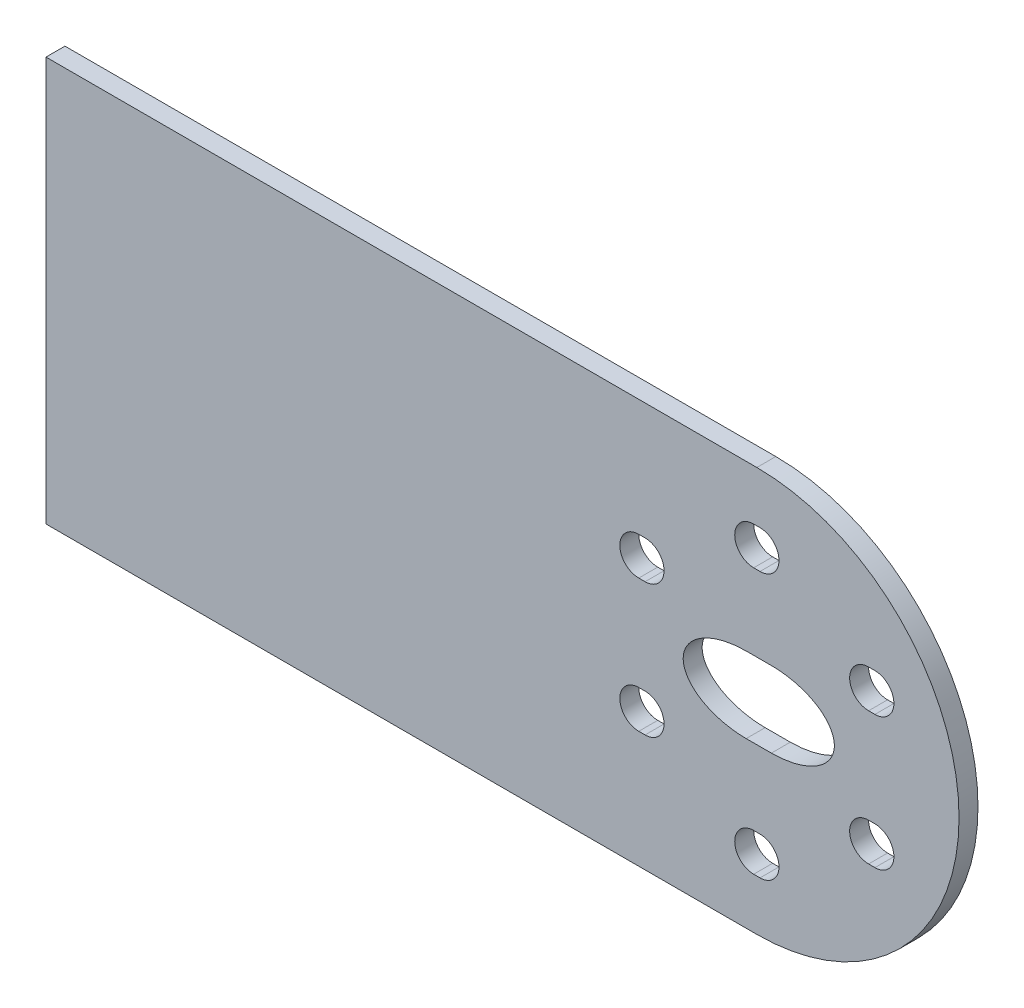
ISO-10303-21;
HEADER;
FILE_DESCRIPTION(('STEP AP214'),'2;1');
FILE_NAME('part.step','',(''),(''),'','','');
FILE_SCHEMA(('AUTOMOTIVE_DESIGN { 1 0 10303 214 1 1 1 1 }'));
ENDSEC;
DATA;
#1=APPLICATION_CONTEXT('core data for automotive mechanical design processes');
#2=APPLICATION_PROTOCOL_DEFINITION('international standard','automotive_design',2000,#1);
#3=PRODUCT_CONTEXT('',#1,'mechanical');
#4=PRODUCT('Part','Part','',(#3));
#5=PRODUCT_RELATED_PRODUCT_CATEGORY('part','',(#4));
#6=PRODUCT_DEFINITION_FORMATION('','',#4);
#7=PRODUCT_DEFINITION_CONTEXT('part definition',#1,'design');
#8=PRODUCT_DEFINITION('design','',#6,#7);
#9=PRODUCT_DEFINITION_SHAPE('','',#8);
#10=(LENGTH_UNIT() NAMED_UNIT(*) SI_UNIT(.MILLI.,.METRE.));
#11=(NAMED_UNIT(*) PLANE_ANGLE_UNIT() SI_UNIT($,.RADIAN.));
#12=(NAMED_UNIT(*) SI_UNIT($,.STERADIAN.) SOLID_ANGLE_UNIT());
#13=UNCERTAINTY_MEASURE_WITH_UNIT(LENGTH_MEASURE(1.E-05),#10,'distance_accuracy_value','');
#14=(GEOMETRIC_REPRESENTATION_CONTEXT(3) GLOBAL_UNCERTAINTY_ASSIGNED_CONTEXT((#13)) GLOBAL_UNIT_ASSIGNED_CONTEXT((#10,
#11,#12)) REPRESENTATION_CONTEXT('',''));
#15=CARTESIAN_POINT('',(0.,0.,0.));
#16=DIRECTION('',(0.,0.,1.));
#17=DIRECTION('',(1.,0.,0.));
#18=AXIS2_PLACEMENT_3D('',#15,#16,#17);
#19=CARTESIAN_POINT('',(0.,-32.,3.));
#20=DIRECTION('',(0.,1.,0.));
#21=DIRECTION('',(0.,0.,1.));
#22=AXIS2_PLACEMENT_3D('',#19,#20,#21);
#23=PLANE('',#22);
#24=DIRECTION('',(1.,0.,0.));
#25=VECTOR('',#24,1.);
#26=CARTESIAN_POINT('',(0.,-32.,0.));
#27=LINE('',#26,#25);
#28=CARTESIAN_POINT('',(-112.5,-32.,0.));
#29=VERTEX_POINT('',#28);
#30=CARTESIAN_POINT('',(0.,-32.,0.));
#31=VERTEX_POINT('',#30);
#32=EDGE_CURVE('E481',#29,#31,#27,.T.);
#33=ORIENTED_EDGE('',*,*,#32,.T.);
#34=DIRECTION('',(0.,0.,-1.));
#35=VECTOR('',#34,1.);
#36=CARTESIAN_POINT('',(0.,-32.,3.));
#37=LINE('',#36,#35);
#38=CARTESIAN_POINT('',(0.,-32.,3.));
#39=VERTEX_POINT('',#38);
#40=EDGE_CURVE('E11',#39,#31,#37,.T.);
#41=ORIENTED_EDGE('',*,*,#40,.F.);
#42=DIRECTION('',(1.,0.,0.));
#43=VECTOR('',#42,1.);
#44=CARTESIAN_POINT('',(0.,-32.,3.));
#45=LINE('',#44,#43);
#46=CARTESIAN_POINT('',(-112.5,-32.,3.));
#47=VERTEX_POINT('',#46);
#48=EDGE_CURVE('E610',#47,#39,#45,.T.);
#49=ORIENTED_EDGE('',*,*,#48,.F.);
#50=DIRECTION('',(0.,0.,-1.));
#51=VECTOR('',#50,1.);
#52=CARTESIAN_POINT('',(-112.5,-32.,3.));
#53=LINE('',#52,#51);
#54=EDGE_CURVE('E493',#47,#29,#53,.T.);
#55=ORIENTED_EDGE('',*,*,#54,.T.);
#56=EDGE_LOOP('',(#33,#41,#49,#55));
#57=FACE_BOUND('',#56,.T.);
#58=ADVANCED_FACE('F38',(#57),#23,.F.);
#59=CARTESIAN_POINT('',(0.,0.,3.));
#60=DIRECTION('',(0.,0.,-1.));
#61=DIRECTION('',(-1.,0.,0.));
#62=AXIS2_PLACEMENT_3D('',#59,#60,#61);
#63=CYLINDRICAL_SURFACE('',#62,32.);
#64=CARTESIAN_POINT('',(0.,0.,0.));
#65=DIRECTION('',(0.,0.,1.));
#66=DIRECTION('',(1.,0.,0.));
#67=AXIS2_PLACEMENT_3D('',#64,#65,#66);
#68=CIRCLE('',#67,32.);
#69=CARTESIAN_POINT('',(0.,32.,0.));
#70=VERTEX_POINT('',#69);
#71=EDGE_CURVE('E484',#31,#70,#68,.T.);
#72=ORIENTED_EDGE('',*,*,#71,.T.);
#73=DIRECTION('',(0.,0.,-1.));
#74=VECTOR('',#73,1.);
#75=CARTESIAN_POINT('',(0.,32.,3.));
#76=LINE('',#75,#74);
#77=CARTESIAN_POINT('',(0.,32.,3.));
#78=VERTEX_POINT('',#77);
#79=EDGE_CURVE('E47',#78,#70,#76,.T.);
#80=ORIENTED_EDGE('',*,*,#79,.F.);
#81=CARTESIAN_POINT('',(0.,0.,3.));
#82=DIRECTION('',(0.,0.,1.));
#83=DIRECTION('',(1.,0.,0.));
#84=AXIS2_PLACEMENT_3D('',#81,#82,#83);
#85=CIRCLE('',#84,32.);
#86=EDGE_CURVE('E613',#39,#78,#85,.T.);
#87=ORIENTED_EDGE('',*,*,#86,.F.);
#88=ORIENTED_EDGE('',*,*,#40,.T.);
#89=EDGE_LOOP('',(#72,#80,#87,#88));
#90=FACE_BOUND('',#89,.T.);
#91=ADVANCED_FACE('F300',(#90),#63,.T.);
#92=CARTESIAN_POINT('',(0.,32.,3.));
#93=DIRECTION('',(0.,1.,0.));
#94=DIRECTION('',(0.,0.,1.));
#95=AXIS2_PLACEMENT_3D('',#92,#93,#94);
#96=PLANE('',#95);
#97=DIRECTION('',(1.,0.,0.));
#98=VECTOR('',#97,1.);
#99=CARTESIAN_POINT('',(0.,32.,0.));
#100=LINE('',#99,#98);
#101=CARTESIAN_POINT('',(-112.5,32.,0.));
#102=VERTEX_POINT('',#101);
#103=EDGE_CURVE('E487',#102,#70,#100,.T.);
#104=ORIENTED_EDGE('',*,*,#103,.F.);
#105=DIRECTION('',(0.,0.,-1.));
#106=VECTOR('',#105,1.);
#107=CARTESIAN_POINT('',(-112.5,32.,3.));
#108=LINE('',#107,#106);
#109=CARTESIAN_POINT('',(-112.5,32.,3.));
#110=VERTEX_POINT('',#109);
#111=EDGE_CURVE('E496',#110,#102,#108,.T.);
#112=ORIENTED_EDGE('',*,*,#111,.F.);
#113=DIRECTION('',(1.,0.,0.));
#114=VECTOR('',#113,1.);
#115=CARTESIAN_POINT('',(0.,32.,3.));
#116=LINE('',#115,#114);
#117=EDGE_CURVE('E615',#110,#78,#116,.T.);
#118=ORIENTED_EDGE('',*,*,#117,.T.);
#119=ORIENTED_EDGE('',*,*,#79,.T.);
#120=EDGE_LOOP('',(#104,#112,#118,#119));
#121=FACE_BOUND('',#120,.T.);
#122=ADVANCED_FACE('F296',(#121),#96,.T.);
#123=CARTESIAN_POINT('',(18.6865334794732,10.5,3.));
#124=DIRECTION('',(0.,0.,-1.));
#125=DIRECTION('',(-1.,0.,0.));
#126=AXIS2_PLACEMENT_3D('',#123,#124,#125);
#127=CYLINDRICAL_SURFACE('',#126,3.);
#128=CARTESIAN_POINT('',(18.6865334794732,10.5,0.));
#129=DIRECTION('',(0.,0.,1.));
#130=DIRECTION('',(1.,0.,0.));
#131=AXIS2_PLACEMENT_3D('',#128,#129,#130);
#132=CIRCLE('',#131,3.);
#133=CARTESIAN_POINT('',(18.6865334794732,7.49999999999999,0.));
#134=VERTEX_POINT('',#133);
#135=CARTESIAN_POINT('',(18.6865334794732,13.5,0.));
#136=VERTEX_POINT('',#135);
#137=EDGE_CURVE('E469',#134,#136,#132,.T.);
#138=ORIENTED_EDGE('',*,*,#137,.F.);
#139=DIRECTION('',(0.,0.,-1.));
#140=VECTOR('',#139,1.);
#141=CARTESIAN_POINT('',(18.6865334794732,7.49999999999999,3.));
#142=LINE('',#141,#140);
#143=CARTESIAN_POINT('',(18.6865334794732,7.49999999999999,3.));
#144=VERTEX_POINT('',#143);
#145=EDGE_CURVE('E497',#144,#134,#142,.T.);
#146=ORIENTED_EDGE('',*,*,#145,.F.);
#147=CARTESIAN_POINT('',(18.6865334794732,10.5,3.));
#148=DIRECTION('',(0.,0.,1.));
#149=DIRECTION('',(1.,0.,0.));
#150=AXIS2_PLACEMENT_3D('',#147,#148,#149);
#151=CIRCLE('',#150,3.);
#152=CARTESIAN_POINT('',(18.6865334794732,13.5,3.));
#153=VERTEX_POINT('',#152);
#154=EDGE_CURVE('E599',#144,#153,#151,.T.);
#155=ORIENTED_EDGE('',*,*,#154,.T.);
#156=DIRECTION('',(0.,0.,-1.));
#157=VECTOR('',#156,1.);
#158=CARTESIAN_POINT('',(18.6865334794732,13.5,3.));
#159=LINE('',#158,#157);
#160=EDGE_CURVE('E500',#153,#136,#159,.T.);
#161=ORIENTED_EDGE('',*,*,#160,.T.);
#162=EDGE_LOOP('',(#138,#146,#155,#161));
#163=FACE_BOUND('',#162,.T.);
#164=ADVANCED_FACE('F299',(#163),#127,.F.);
#165=CARTESIAN_POINT('',(0.,7.49999999999999,3.));
#166=DIRECTION('',(0.,1.,0.));
#167=DIRECTION('',(0.,0.,1.));
#168=AXIS2_PLACEMENT_3D('',#165,#166,#167);
#169=PLANE('',#168);
#170=DIRECTION('',(1.,0.,0.));
#171=VECTOR('',#170,1.);
#172=CARTESIAN_POINT('',(0.,7.49999999999999,0.));
#173=LINE('',#172,#171);
#174=CARTESIAN_POINT('',(17.6865334794732,7.49999999999999,0.));
#175=VERTEX_POINT('',#174);
#176=EDGE_CURVE('E472',#175,#134,#173,.T.);
#177=ORIENTED_EDGE('',*,*,#176,.F.);
#178=DIRECTION('',(0.,0.,-1.));
#179=VECTOR('',#178,1.);
#180=CARTESIAN_POINT('',(17.6865334794732,7.49999999999999,3.));
#181=LINE('',#180,#179);
#182=CARTESIAN_POINT('',(17.6865334794732,7.49999999999999,3.));
#183=VERTEX_POINT('',#182);
#184=EDGE_CURVE('E505',#183,#175,#181,.T.);
#185=ORIENTED_EDGE('',*,*,#184,.F.);
#186=DIRECTION('',(1.,0.,0.));
#187=VECTOR('',#186,1.);
#188=CARTESIAN_POINT('',(0.,7.49999999999999,3.));
#189=LINE('',#188,#187);
#190=EDGE_CURVE('E602',#183,#144,#189,.T.);
#191=ORIENTED_EDGE('',*,*,#190,.T.);
#192=ORIENTED_EDGE('',*,*,#145,.T.);
#193=EDGE_LOOP('',(#177,#185,#191,#192));
#194=FACE_BOUND('',#193,.T.);
#195=ADVANCED_FACE('F318',(#194),#169,.T.);
#196=CARTESIAN_POINT('',(17.6865334794732,10.5,3.));
#197=DIRECTION('',(0.,0.,-1.));
#198=DIRECTION('',(-1.,0.,0.));
#199=AXIS2_PLACEMENT_3D('',#196,#197,#198);
#200=CYLINDRICAL_SURFACE('',#199,3.);
#201=CARTESIAN_POINT('',(17.6865334794732,10.5,0.));
#202=DIRECTION('',(0.,0.,1.));
#203=DIRECTION('',(1.,0.,0.));
#204=AXIS2_PLACEMENT_3D('',#201,#202,#203);
#205=CIRCLE('',#204,3.);
#206=CARTESIAN_POINT('',(17.6865334794732,13.5,0.));
#207=VERTEX_POINT('',#206);
#208=EDGE_CURVE('E475',#207,#175,#205,.T.);
#209=ORIENTED_EDGE('',*,*,#208,.F.);
#210=DIRECTION('',(0.,0.,-1.));
#211=VECTOR('',#210,1.);
#212=CARTESIAN_POINT('',(17.6865334794732,13.5,3.));
#213=LINE('',#212,#211);
#214=CARTESIAN_POINT('',(17.6865334794732,13.5,3.));
#215=VERTEX_POINT('',#214);
#216=EDGE_CURVE('E502',#215,#207,#213,.T.);
#217=ORIENTED_EDGE('',*,*,#216,.F.);
#218=CARTESIAN_POINT('',(17.6865334794732,10.5,3.));
#219=DIRECTION('',(0.,0.,1.));
#220=DIRECTION('',(1.,0.,0.));
#221=AXIS2_PLACEMENT_3D('',#218,#219,#220);
#222=CIRCLE('',#221,3.);
#223=EDGE_CURVE('E605',#215,#183,#222,.T.);
#224=ORIENTED_EDGE('',*,*,#223,.T.);
#225=ORIENTED_EDGE('',*,*,#184,.T.);
#226=EDGE_LOOP('',(#209,#217,#224,#225));
#227=FACE_BOUND('',#226,.T.);
#228=ADVANCED_FACE('F314',(#227),#200,.F.);
#229=CARTESIAN_POINT('',(18.6865334794732,-10.5,3.));
#230=DIRECTION('',(0.,0.,-1.));
#231=DIRECTION('',(-1.,0.,0.));
#232=AXIS2_PLACEMENT_3D('',#229,#230,#231);
#233=CYLINDRICAL_SURFACE('',#232,3.);
#234=CARTESIAN_POINT('',(18.6865334794732,-10.5,0.));
#235=DIRECTION('',(0.,0.,1.));
#236=DIRECTION('',(1.,0.,0.));
#237=AXIS2_PLACEMENT_3D('',#234,#235,#236);
#238=CIRCLE('',#237,3.);
#239=CARTESIAN_POINT('',(18.6865334794732,-13.5,0.));
#240=VERTEX_POINT('',#239);
#241=CARTESIAN_POINT('',(18.6865334794732,-7.50000000000002,0.));
#242=VERTEX_POINT('',#241);
#243=EDGE_CURVE('E457',#240,#242,#238,.T.);
#244=ORIENTED_EDGE('',*,*,#243,.F.);
#245=DIRECTION('',(0.,0.,-1.));
#246=VECTOR('',#245,1.);
#247=CARTESIAN_POINT('',(18.6865334794732,-13.5,3.));
#248=LINE('',#247,#246);
#249=CARTESIAN_POINT('',(18.6865334794732,-13.5,3.));
#250=VERTEX_POINT('',#249);
#251=EDGE_CURVE('E503',#250,#240,#248,.T.);
#252=ORIENTED_EDGE('',*,*,#251,.F.);
#253=CARTESIAN_POINT('',(18.6865334794732,-10.5,3.));
#254=DIRECTION('',(0.,0.,1.));
#255=DIRECTION('',(1.,0.,0.));
#256=AXIS2_PLACEMENT_3D('',#253,#254,#255);
#257=CIRCLE('',#256,3.);
#258=CARTESIAN_POINT('',(18.6865334794732,-7.50000000000002,3.));
#259=VERTEX_POINT('',#258);
#260=EDGE_CURVE('E588',#250,#259,#257,.T.);
#261=ORIENTED_EDGE('',*,*,#260,.T.);
#262=DIRECTION('',(0.,0.,-1.));
#263=VECTOR('',#262,1.);
#264=CARTESIAN_POINT('',(18.6865334794732,-7.50000000000002,3.));
#265=LINE('',#264,#263);
#266=EDGE_CURVE('E508',#259,#242,#265,.T.);
#267=ORIENTED_EDGE('',*,*,#266,.T.);
#268=EDGE_LOOP('',(#244,#252,#261,#267));
#269=FACE_BOUND('',#268,.T.);
#270=ADVANCED_FACE('F317',(#269),#233,.F.);
#271=CARTESIAN_POINT('',(0.,-13.5,3.));
#272=DIRECTION('',(0.,1.,0.));
#273=DIRECTION('',(0.,0.,1.));
#274=AXIS2_PLACEMENT_3D('',#271,#272,#273);
#275=PLANE('',#274);
#276=DIRECTION('',(1.,0.,0.));
#277=VECTOR('',#276,1.);
#278=CARTESIAN_POINT('',(0.,-13.5,0.));
#279=LINE('',#278,#277);
#280=CARTESIAN_POINT('',(17.6865334794732,-13.5,0.));
#281=VERTEX_POINT('',#280);
#282=EDGE_CURVE('E460',#281,#240,#279,.T.);
#283=ORIENTED_EDGE('',*,*,#282,.F.);
#284=DIRECTION('',(0.,0.,-1.));
#285=VECTOR('',#284,1.);
#286=CARTESIAN_POINT('',(17.6865334794732,-13.5,3.));
#287=LINE('',#286,#285);
#288=CARTESIAN_POINT('',(17.6865334794732,-13.5,3.));
#289=VERTEX_POINT('',#288);
#290=EDGE_CURVE('E513',#289,#281,#287,.T.);
#291=ORIENTED_EDGE('',*,*,#290,.F.);
#292=DIRECTION('',(1.,0.,0.));
#293=VECTOR('',#292,1.);
#294=CARTESIAN_POINT('',(0.,-13.5,3.));
#295=LINE('',#294,#293);
#296=EDGE_CURVE('E591',#289,#250,#295,.T.);
#297=ORIENTED_EDGE('',*,*,#296,.T.);
#298=ORIENTED_EDGE('',*,*,#251,.T.);
#299=EDGE_LOOP('',(#283,#291,#297,#298));
#300=FACE_BOUND('',#299,.T.);
#301=ADVANCED_FACE('F334',(#300),#275,.T.);
#302=CARTESIAN_POINT('',(17.6865334794732,-10.5,3.));
#303=DIRECTION('',(0.,0.,-1.));
#304=DIRECTION('',(-1.,0.,0.));
#305=AXIS2_PLACEMENT_3D('',#302,#303,#304);
#306=CYLINDRICAL_SURFACE('',#305,3.);
#307=CARTESIAN_POINT('',(17.6865334794732,-10.5,0.));
#308=DIRECTION('',(0.,0.,1.));
#309=DIRECTION('',(1.,0.,0.));
#310=AXIS2_PLACEMENT_3D('',#307,#308,#309);
#311=CIRCLE('',#310,3.);
#312=CARTESIAN_POINT('',(17.6865334794732,-7.50000000000002,0.));
#313=VERTEX_POINT('',#312);
#314=EDGE_CURVE('E463',#313,#281,#311,.T.);
#315=ORIENTED_EDGE('',*,*,#314,.F.);
#316=DIRECTION('',(0.,0.,-1.));
#317=VECTOR('',#316,1.);
#318=CARTESIAN_POINT('',(17.6865334794732,-7.50000000000002,3.));
#319=LINE('',#318,#317);
#320=CARTESIAN_POINT('',(17.6865334794732,-7.50000000000002,3.));
#321=VERTEX_POINT('',#320);
#322=EDGE_CURVE('E510',#321,#313,#319,.T.);
#323=ORIENTED_EDGE('',*,*,#322,.F.);
#324=CARTESIAN_POINT('',(17.6865334794732,-10.5,3.));
#325=DIRECTION('',(0.,0.,1.));
#326=DIRECTION('',(1.,0.,0.));
#327=AXIS2_PLACEMENT_3D('',#324,#325,#326);
#328=CIRCLE('',#327,3.);
#329=EDGE_CURVE('E594',#321,#289,#328,.T.);
#330=ORIENTED_EDGE('',*,*,#329,.T.);
#331=ORIENTED_EDGE('',*,*,#290,.T.);
#332=EDGE_LOOP('',(#315,#323,#330,#331));
#333=FACE_BOUND('',#332,.T.);
#334=ADVANCED_FACE('F330',(#333),#306,.F.);
#335=CARTESIAN_POINT('',(0.500000000000016,-21.,3.));
#336=DIRECTION('',(0.,0.,-1.));
#337=DIRECTION('',(-1.,0.,0.));
#338=AXIS2_PLACEMENT_3D('',#335,#336,#337);
#339=CYLINDRICAL_SURFACE('',#338,3.);
#340=CARTESIAN_POINT('',(0.500000000000016,-21.,0.));
#341=DIRECTION('',(0.,0.,1.));
#342=DIRECTION('',(1.,0.,0.));
#343=AXIS2_PLACEMENT_3D('',#340,#341,#342);
#344=CIRCLE('',#343,3.);
#345=CARTESIAN_POINT('',(0.500000000000017,-24.,0.));
#346=VERTEX_POINT('',#345);
#347=CARTESIAN_POINT('',(0.500000000000015,-18.,0.));
#348=VERTEX_POINT('',#347);
#349=EDGE_CURVE('E445',#346,#348,#344,.T.);
#350=ORIENTED_EDGE('',*,*,#349,.F.);
#351=DIRECTION('',(0.,0.,-1.));
#352=VECTOR('',#351,1.);
#353=CARTESIAN_POINT('',(0.500000000000017,-24.,3.));
#354=LINE('',#353,#352);
#355=CARTESIAN_POINT('',(0.500000000000017,-24.,3.));
#356=VERTEX_POINT('',#355);
#357=EDGE_CURVE('E511',#356,#346,#354,.T.);
#358=ORIENTED_EDGE('',*,*,#357,.F.);
#359=CARTESIAN_POINT('',(0.500000000000016,-21.,3.));
#360=DIRECTION('',(0.,0.,1.));
#361=DIRECTION('',(1.,0.,0.));
#362=AXIS2_PLACEMENT_3D('',#359,#360,#361);
#363=CIRCLE('',#362,3.);
#364=CARTESIAN_POINT('',(0.500000000000015,-18.,3.));
#365=VERTEX_POINT('',#364);
#366=EDGE_CURVE('E577',#356,#365,#363,.T.);
#367=ORIENTED_EDGE('',*,*,#366,.T.);
#368=DIRECTION('',(0.,0.,-1.));
#369=VECTOR('',#368,1.);
#370=CARTESIAN_POINT('',(0.500000000000015,-18.,3.));
#371=LINE('',#370,#369);
#372=EDGE_CURVE('E516',#365,#348,#371,.T.);
#373=ORIENTED_EDGE('',*,*,#372,.T.);
#374=EDGE_LOOP('',(#350,#358,#367,#373));
#375=FACE_BOUND('',#374,.T.);
#376=ADVANCED_FACE('F333',(#375),#339,.F.);
#377=CARTESIAN_POINT('',(0.,-24.,3.));
#378=DIRECTION('',(0.,1.,0.));
#379=DIRECTION('',(0.,0.,1.));
#380=AXIS2_PLACEMENT_3D('',#377,#378,#379);
#381=PLANE('',#380);
#382=DIRECTION('',(1.,0.,0.));
#383=VECTOR('',#382,1.);
#384=CARTESIAN_POINT('',(0.,-24.,0.));
#385=LINE('',#384,#383);
#386=CARTESIAN_POINT('',(-0.499999999999985,-24.,0.));
#387=VERTEX_POINT('',#386);
#388=EDGE_CURVE('E448',#387,#346,#385,.T.);
#389=ORIENTED_EDGE('',*,*,#388,.F.);
#390=DIRECTION('',(0.,0.,-1.));
#391=VECTOR('',#390,1.);
#392=CARTESIAN_POINT('',(-0.499999999999985,-24.,3.));
#393=LINE('',#392,#391);
#394=CARTESIAN_POINT('',(-0.499999999999985,-24.,3.));
#395=VERTEX_POINT('',#394);
#396=EDGE_CURVE('E521',#395,#387,#393,.T.);
#397=ORIENTED_EDGE('',*,*,#396,.F.);
#398=DIRECTION('',(1.,0.,0.));
#399=VECTOR('',#398,1.);
#400=CARTESIAN_POINT('',(0.,-24.,3.));
#401=LINE('',#400,#399);
#402=EDGE_CURVE('E580',#395,#356,#401,.T.);
#403=ORIENTED_EDGE('',*,*,#402,.T.);
#404=ORIENTED_EDGE('',*,*,#357,.T.);
#405=EDGE_LOOP('',(#389,#397,#403,#404));
#406=FACE_BOUND('',#405,.T.);
#407=ADVANCED_FACE('F350',(#406),#381,.T.);
#408=CARTESIAN_POINT('',(-0.499999999999985,-21.,3.));
#409=DIRECTION('',(0.,0.,-1.));
#410=DIRECTION('',(-1.,0.,0.));
#411=AXIS2_PLACEMENT_3D('',#408,#409,#410);
#412=CYLINDRICAL_SURFACE('',#411,3.);
#413=CARTESIAN_POINT('',(-0.499999999999985,-21.,0.));
#414=DIRECTION('',(0.,0.,1.));
#415=DIRECTION('',(1.,0.,0.));
#416=AXIS2_PLACEMENT_3D('',#413,#414,#415);
#417=CIRCLE('',#416,3.);
#418=CARTESIAN_POINT('',(-0.499999999999985,-18.,0.));
#419=VERTEX_POINT('',#418);
#420=EDGE_CURVE('E451',#419,#387,#417,.T.);
#421=ORIENTED_EDGE('',*,*,#420,.F.);
#422=DIRECTION('',(0.,0.,-1.));
#423=VECTOR('',#422,1.);
#424=CARTESIAN_POINT('',(-0.499999999999985,-18.,3.));
#425=LINE('',#424,#423);
#426=CARTESIAN_POINT('',(-0.499999999999985,-18.,3.));
#427=VERTEX_POINT('',#426);
#428=EDGE_CURVE('E518',#427,#419,#425,.T.);
#429=ORIENTED_EDGE('',*,*,#428,.F.);
#430=CARTESIAN_POINT('',(-0.499999999999985,-21.,3.));
#431=DIRECTION('',(0.,0.,1.));
#432=DIRECTION('',(1.,0.,0.));
#433=AXIS2_PLACEMENT_3D('',#430,#431,#432);
#434=CIRCLE('',#433,3.);
#435=EDGE_CURVE('E583',#427,#395,#434,.T.);
#436=ORIENTED_EDGE('',*,*,#435,.T.);
#437=ORIENTED_EDGE('',*,*,#396,.T.);
#438=EDGE_LOOP('',(#421,#429,#436,#437));
#439=FACE_BOUND('',#438,.T.);
#440=ADVANCED_FACE('F346',(#439),#412,.F.);
#441=CARTESIAN_POINT('',(-17.6865334794732,-10.5,3.));
#442=DIRECTION('',(0.,0.,-1.));
#443=DIRECTION('',(-1.,0.,0.));
#444=AXIS2_PLACEMENT_3D('',#441,#442,#443);
#445=CYLINDRICAL_SURFACE('',#444,3.);
#446=CARTESIAN_POINT('',(-17.6865334794732,-10.5,0.));
#447=DIRECTION('',(0.,0.,1.));
#448=DIRECTION('',(1.,0.,0.));
#449=AXIS2_PLACEMENT_3D('',#446,#447,#448);
#450=CIRCLE('',#449,3.);
#451=CARTESIAN_POINT('',(-17.6865334794732,-13.5,0.));
#452=VERTEX_POINT('',#451);
#453=CARTESIAN_POINT('',(-17.6865334794732,-7.50000000000002,0.));
#454=VERTEX_POINT('',#453);
#455=EDGE_CURVE('E433',#452,#454,#450,.T.);
#456=ORIENTED_EDGE('',*,*,#455,.F.);
#457=DIRECTION('',(0.,0.,-1.));
#458=VECTOR('',#457,1.);
#459=CARTESIAN_POINT('',(-17.6865334794732,-13.5,3.));
#460=LINE('',#459,#458);
#461=CARTESIAN_POINT('',(-17.6865334794732,-13.5,3.));
#462=VERTEX_POINT('',#461);
#463=EDGE_CURVE('E519',#462,#452,#460,.T.);
#464=ORIENTED_EDGE('',*,*,#463,.F.);
#465=CARTESIAN_POINT('',(-17.6865334794732,-10.5,3.));
#466=DIRECTION('',(0.,0.,1.));
#467=DIRECTION('',(1.,0.,0.));
#468=AXIS2_PLACEMENT_3D('',#465,#466,#467);
#469=CIRCLE('',#468,3.);
#470=CARTESIAN_POINT('',(-17.6865334794732,-7.50000000000002,3.));
#471=VERTEX_POINT('',#470);
#472=EDGE_CURVE('E566',#462,#471,#469,.T.);
#473=ORIENTED_EDGE('',*,*,#472,.T.);
#474=DIRECTION('',(0.,0.,-1.));
#475=VECTOR('',#474,1.);
#476=CARTESIAN_POINT('',(-17.6865334794732,-7.50000000000002,3.));
#477=LINE('',#476,#475);
#478=EDGE_CURVE('E524',#471,#454,#477,.T.);
#479=ORIENTED_EDGE('',*,*,#478,.T.);
#480=EDGE_LOOP('',(#456,#464,#473,#479));
#481=FACE_BOUND('',#480,.T.);
#482=ADVANCED_FACE('F349',(#481),#445,.F.);
#483=CARTESIAN_POINT('',(0.,-13.5,3.));
#484=DIRECTION('',(0.,1.,0.));
#485=DIRECTION('',(0.,0.,1.));
#486=AXIS2_PLACEMENT_3D('',#483,#484,#485);
#487=PLANE('',#486);
#488=DIRECTION('',(1.,0.,0.));
#489=VECTOR('',#488,1.);
#490=CARTESIAN_POINT('',(0.,-13.5,0.));
#491=LINE('',#490,#489);
#492=CARTESIAN_POINT('',(-18.6865334794732,-13.5,0.));
#493=VERTEX_POINT('',#492);
#494=EDGE_CURVE('E436',#493,#452,#491,.T.);
#495=ORIENTED_EDGE('',*,*,#494,.F.);
#496=DIRECTION('',(0.,0.,-1.));
#497=VECTOR('',#496,1.);
#498=CARTESIAN_POINT('',(-18.6865334794732,-13.5,3.));
#499=LINE('',#498,#497);
#500=CARTESIAN_POINT('',(-18.6865334794732,-13.5,3.));
#501=VERTEX_POINT('',#500);
#502=EDGE_CURVE('E529',#501,#493,#499,.T.);
#503=ORIENTED_EDGE('',*,*,#502,.F.);
#504=DIRECTION('',(1.,0.,0.));
#505=VECTOR('',#504,1.);
#506=CARTESIAN_POINT('',(0.,-13.5,3.));
#507=LINE('',#506,#505);
#508=EDGE_CURVE('E569',#501,#462,#507,.T.);
#509=ORIENTED_EDGE('',*,*,#508,.T.);
#510=ORIENTED_EDGE('',*,*,#463,.T.);
#511=EDGE_LOOP('',(#495,#503,#509,#510));
#512=FACE_BOUND('',#511,.T.);
#513=ADVANCED_FACE('F366',(#512),#487,.T.);
#514=CARTESIAN_POINT('',(-18.6865334794732,-10.5,3.));
#515=DIRECTION('',(0.,0.,-1.));
#516=DIRECTION('',(-1.,0.,0.));
#517=AXIS2_PLACEMENT_3D('',#514,#515,#516);
#518=CYLINDRICAL_SURFACE('',#517,3.);
#519=CARTESIAN_POINT('',(-18.6865334794732,-10.5,0.));
#520=DIRECTION('',(0.,0.,1.));
#521=DIRECTION('',(1.,0.,0.));
#522=AXIS2_PLACEMENT_3D('',#519,#520,#521);
#523=CIRCLE('',#522,3.);
#524=CARTESIAN_POINT('',(-18.6865334794732,-7.50000000000002,0.));
#525=VERTEX_POINT('',#524);
#526=EDGE_CURVE('E439',#525,#493,#523,.T.);
#527=ORIENTED_EDGE('',*,*,#526,.F.);
#528=DIRECTION('',(0.,0.,-1.));
#529=VECTOR('',#528,1.);
#530=CARTESIAN_POINT('',(-18.6865334794732,-7.50000000000002,3.));
#531=LINE('',#530,#529);
#532=CARTESIAN_POINT('',(-18.6865334794732,-7.50000000000002,3.));
#533=VERTEX_POINT('',#532);
#534=EDGE_CURVE('E526',#533,#525,#531,.T.);
#535=ORIENTED_EDGE('',*,*,#534,.F.);
#536=CARTESIAN_POINT('',(-18.6865334794732,-10.5,3.));
#537=DIRECTION('',(0.,0.,1.));
#538=DIRECTION('',(1.,0.,0.));
#539=AXIS2_PLACEMENT_3D('',#536,#537,#538);
#540=CIRCLE('',#539,3.);
#541=EDGE_CURVE('E572',#533,#501,#540,.T.);
#542=ORIENTED_EDGE('',*,*,#541,.T.);
#543=ORIENTED_EDGE('',*,*,#502,.T.);
#544=EDGE_LOOP('',(#527,#535,#542,#543));
#545=FACE_BOUND('',#544,.T.);
#546=ADVANCED_FACE('F362',(#545),#518,.F.);
#547=CARTESIAN_POINT('',(-18.6865334794732,10.5,3.));
#548=DIRECTION('',(0.,0.,-1.));
#549=DIRECTION('',(-1.,0.,0.));
#550=AXIS2_PLACEMENT_3D('',#547,#548,#549);
#551=CYLINDRICAL_SURFACE('',#550,3.);
#552=CARTESIAN_POINT('',(-18.6865334794732,10.5,0.));
#553=DIRECTION('',(0.,0.,1.));
#554=DIRECTION('',(1.,0.,0.));
#555=AXIS2_PLACEMENT_3D('',#552,#553,#554);
#556=CIRCLE('',#555,3.);
#557=CARTESIAN_POINT('',(-18.6865334794732,13.5,0.));
#558=VERTEX_POINT('',#557);
#559=CARTESIAN_POINT('',(-18.6865334794732,7.49999999999999,0.));
#560=VERTEX_POINT('',#559);
#561=EDGE_CURVE('E418',#558,#560,#556,.T.);
#562=ORIENTED_EDGE('',*,*,#561,.F.);
#563=DIRECTION('',(0.,0.,-1.));
#564=VECTOR('',#563,1.);
#565=CARTESIAN_POINT('',(-18.6865334794732,13.5,3.));
#566=LINE('',#565,#564);
#567=CARTESIAN_POINT('',(-18.6865334794732,13.5,3.));
#568=VERTEX_POINT('',#567);
#569=EDGE_CURVE('E527',#568,#558,#566,.T.);
#570=ORIENTED_EDGE('',*,*,#569,.F.);
#571=CARTESIAN_POINT('',(-18.6865334794732,10.5,3.));
#572=DIRECTION('',(0.,0.,1.));
#573=DIRECTION('',(1.,0.,0.));
#574=AXIS2_PLACEMENT_3D('',#571,#572,#573);
#575=CIRCLE('',#574,3.);
#576=CARTESIAN_POINT('',(-18.6865334794732,7.49999999999999,3.));
#577=VERTEX_POINT('',#576);
#578=EDGE_CURVE('E551',#568,#577,#575,.T.);
#579=ORIENTED_EDGE('',*,*,#578,.T.);
#580=DIRECTION('',(0.,0.,-1.));
#581=VECTOR('',#580,1.);
#582=CARTESIAN_POINT('',(-18.6865334794732,7.49999999999999,3.));
#583=LINE('',#582,#581);
#584=EDGE_CURVE('E532',#577,#560,#583,.T.);
#585=ORIENTED_EDGE('',*,*,#584,.T.);
#586=EDGE_LOOP('',(#562,#570,#579,#585));
#587=FACE_BOUND('',#586,.T.);
#588=ADVANCED_FACE('F365',(#587),#551,.F.);
#589=CARTESIAN_POINT('',(0.,13.5,3.));
#590=DIRECTION('',(0.,-1.,0.));
#591=DIRECTION('',(0.,0.,-1.));
#592=AXIS2_PLACEMENT_3D('',#589,#590,#591);
#593=PLANE('',#592);
#594=DIRECTION('',(-1.,0.,0.));
#595=VECTOR('',#594,1.);
#596=CARTESIAN_POINT('',(0.,13.5,0.));
#597=LINE('',#596,#595);
#598=CARTESIAN_POINT('',(-17.6865334794732,13.5,0.));
#599=VERTEX_POINT('',#598);
#600=EDGE_CURVE('E424',#599,#558,#597,.T.);
#601=ORIENTED_EDGE('',*,*,#600,.F.);
#602=DIRECTION('',(0.,0.,-1.));
#603=VECTOR('',#602,1.);
#604=CARTESIAN_POINT('',(-17.6865334794732,13.5,3.));
#605=LINE('',#604,#603);
#606=CARTESIAN_POINT('',(-17.6865334794732,13.5,3.));
#607=VERTEX_POINT('',#606);
#608=EDGE_CURVE('E536',#607,#599,#605,.T.);
#609=ORIENTED_EDGE('',*,*,#608,.F.);
#610=DIRECTION('',(-1.,0.,0.));
#611=VECTOR('',#610,1.);
#612=CARTESIAN_POINT('',(0.,13.5,3.));
#613=LINE('',#612,#611);
#614=EDGE_CURVE('E558',#607,#568,#613,.T.);
#615=ORIENTED_EDGE('',*,*,#614,.T.);
#616=ORIENTED_EDGE('',*,*,#569,.T.);
#617=EDGE_LOOP('',(#601,#609,#615,#616));
#618=FACE_BOUND('',#617,.T.);
#619=ADVANCED_FACE('F380',(#618),#593,.T.);
#620=CARTESIAN_POINT('',(-17.6865334794732,10.5,3.));
#621=DIRECTION('',(0.,0.,-1.));
#622=DIRECTION('',(-1.,0.,0.));
#623=AXIS2_PLACEMENT_3D('',#620,#621,#622);
#624=CYLINDRICAL_SURFACE('',#623,3.);
#625=CARTESIAN_POINT('',(-17.6865334794732,10.5,0.));
#626=DIRECTION('',(0.,0.,1.));
#627=DIRECTION('',(1.,0.,0.));
#628=AXIS2_PLACEMENT_3D('',#625,#626,#627);
#629=CIRCLE('',#628,3.);
#630=CARTESIAN_POINT('',(-17.6865334794732,7.49999999999999,0.));
#631=VERTEX_POINT('',#630);
#632=EDGE_CURVE('E427',#631,#599,#629,.T.);
#633=ORIENTED_EDGE('',*,*,#632,.F.);
#634=DIRECTION('',(0.,0.,-1.));
#635=VECTOR('',#634,1.);
#636=CARTESIAN_POINT('',(-17.6865334794732,7.49999999999999,3.));
#637=LINE('',#636,#635);
#638=CARTESIAN_POINT('',(-17.6865334794732,7.49999999999999,3.));
#639=VERTEX_POINT('',#638);
#640=EDGE_CURVE('E534',#639,#631,#637,.T.);
#641=ORIENTED_EDGE('',*,*,#640,.F.);
#642=CARTESIAN_POINT('',(-17.6865334794732,10.5,3.));
#643=DIRECTION('',(0.,0.,1.));
#644=DIRECTION('',(1.,0.,0.));
#645=AXIS2_PLACEMENT_3D('',#642,#643,#644);
#646=CIRCLE('',#645,3.);
#647=EDGE_CURVE('E561',#639,#607,#646,.T.);
#648=ORIENTED_EDGE('',*,*,#647,.T.);
#649=ORIENTED_EDGE('',*,*,#608,.T.);
#650=EDGE_LOOP('',(#633,#641,#648,#649));
#651=FACE_BOUND('',#650,.T.);
#652=ADVANCED_FACE('F377',(#651),#624,.F.);
#653=CARTESIAN_POINT('',(-0.499999999999998,21.,3.));
#654=DIRECTION('',(0.,0.,-1.));
#655=DIRECTION('',(-1.,0.,0.));
#656=AXIS2_PLACEMENT_3D('',#653,#654,#655);
#657=CYLINDRICAL_SURFACE('',#656,3.);
#658=CARTESIAN_POINT('',(-0.499999999999998,21.,0.));
#659=DIRECTION('',(0.,0.,1.));
#660=DIRECTION('',(1.,0.,0.));
#661=AXIS2_PLACEMENT_3D('',#658,#659,#660);
#662=CIRCLE('',#661,3.);
#663=CARTESIAN_POINT('',(-0.499999999999998,24.,0.));
#664=VERTEX_POINT('',#663);
#665=CARTESIAN_POINT('',(-0.499999999999997,18.,0.));
#666=VERTEX_POINT('',#665);
#667=EDGE_CURVE('E410',#664,#666,#662,.T.);
#668=ORIENTED_EDGE('',*,*,#667,.F.);
#669=DIRECTION('',(0.,0.,-1.));
#670=VECTOR('',#669,1.);
#671=CARTESIAN_POINT('',(-0.499999999999998,24.,3.));
#672=LINE('',#671,#670);
#673=CARTESIAN_POINT('',(-0.499999999999998,24.,3.));
#674=VERTEX_POINT('',#673);
#675=EDGE_CURVE('E42',#674,#664,#672,.T.);
#676=ORIENTED_EDGE('',*,*,#675,.F.);
#677=CARTESIAN_POINT('',(-0.499999999999998,21.,3.));
#678=DIRECTION('',(0.,0.,1.));
#679=DIRECTION('',(1.,0.,0.));
#680=AXIS2_PLACEMENT_3D('',#677,#678,#679);
#681=CIRCLE('',#680,3.);
#682=CARTESIAN_POINT('',(-0.499999999999997,18.,3.));
#683=VERTEX_POINT('',#682);
#684=EDGE_CURVE('E492',#674,#683,#681,.T.);
#685=ORIENTED_EDGE('',*,*,#684,.T.);
#686=DIRECTION('',(0.,0.,-1.));
#687=VECTOR('',#686,1.);
#688=CARTESIAN_POINT('',(-0.499999999999997,18.,3.));
#689=LINE('',#688,#687);
#690=EDGE_CURVE('E539',#683,#666,#689,.T.);
#691=ORIENTED_EDGE('',*,*,#690,.T.);
#692=EDGE_LOOP('',(#668,#676,#685,#691));
#693=FACE_BOUND('',#692,.T.);
#694=ADVANCED_FACE('F40',(#693),#657,.F.);
#695=CARTESIAN_POINT('',(0.,24.,3.));
#696=DIRECTION('',(0.,-1.,0.));
#697=DIRECTION('',(0.,0.,-1.));
#698=AXIS2_PLACEMENT_3D('',#695,#696,#697);
#699=PLANE('',#698);
#700=DIRECTION('',(-1.,0.,0.));
#701=VECTOR('',#700,1.);
#702=CARTESIAN_POINT('',(0.,24.,0.));
#703=LINE('',#702,#701);
#704=CARTESIAN_POINT('',(0.500000000000002,24.,0.));
#705=VERTEX_POINT('',#704);
#706=EDGE_CURVE('E402',#705,#664,#703,.T.);
#707=ORIENTED_EDGE('',*,*,#706,.F.);
#708=DIRECTION('',(0.,0.,-1.));
#709=VECTOR('',#708,1.);
#710=CARTESIAN_POINT('',(0.500000000000002,24.,3.));
#711=LINE('',#710,#709);
#712=CARTESIAN_POINT('',(0.500000000000002,24.,3.));
#713=VERTEX_POINT('',#712);
#714=EDGE_CURVE('E405',#713,#705,#711,.T.);
#715=ORIENTED_EDGE('',*,*,#714,.F.);
#716=DIRECTION('',(-1.,0.,0.));
#717=VECTOR('',#716,1.);
#718=CARTESIAN_POINT('',(0.,24.,3.));
#719=LINE('',#718,#717);
#720=EDGE_CURVE('E549',#713,#674,#719,.T.);
#721=ORIENTED_EDGE('',*,*,#720,.T.);
#722=ORIENTED_EDGE('',*,*,#675,.T.);
#723=EDGE_LOOP('',(#707,#715,#721,#722));
#724=FACE_BOUND('',#723,.T.);
#725=ADVANCED_FACE('F392',(#724),#699,.T.);
#726=CARTESIAN_POINT('',(0.500000000000003,21.,3.));
#727=DIRECTION('',(0.,0.,-1.));
#728=DIRECTION('',(-1.,0.,0.));
#729=AXIS2_PLACEMENT_3D('',#726,#727,#728);
#730=CYLINDRICAL_SURFACE('',#729,3.);
#731=CARTESIAN_POINT('',(0.500000000000003,21.,0.));
#732=DIRECTION('',(0.,0.,1.));
#733=DIRECTION('',(1.,0.,0.));
#734=AXIS2_PLACEMENT_3D('',#731,#732,#733);
#735=CIRCLE('',#734,3.);
#736=CARTESIAN_POINT('',(0.500000000000005,18.,0.));
#737=VERTEX_POINT('',#736);
#738=EDGE_CURVE('E409',#737,#705,#735,.T.);
#739=ORIENTED_EDGE('',*,*,#738,.F.);
#740=DIRECTION('',(0.,0.,-1.));
#741=VECTOR('',#740,1.);
#742=CARTESIAN_POINT('',(0.500000000000005,18.,3.));
#743=LINE('',#742,#741);
#744=CARTESIAN_POINT('',(0.500000000000005,18.,3.));
#745=VERTEX_POINT('',#744);
#746=EDGE_CURVE('E541',#745,#737,#743,.T.);
#747=ORIENTED_EDGE('',*,*,#746,.F.);
#748=CARTESIAN_POINT('',(0.500000000000003,21.,3.));
#749=DIRECTION('',(0.,0.,1.));
#750=DIRECTION('',(1.,0.,0.));
#751=AXIS2_PLACEMENT_3D('',#748,#749,#750);
#752=CIRCLE('',#751,3.);
#753=EDGE_CURVE('E545',#745,#713,#752,.T.);
#754=ORIENTED_EDGE('',*,*,#753,.T.);
#755=ORIENTED_EDGE('',*,*,#714,.T.);
#756=EDGE_LOOP('',(#739,#747,#754,#755));
#757=FACE_BOUND('',#756,.T.);
#758=ADVANCED_FACE('F312',(#757),#730,.F.);
#759=CARTESIAN_POINT('',(0.,13.5,3.));
#760=DIRECTION('',(0.,1.,0.));
#761=DIRECTION('',(0.,0.,1.));
#762=AXIS2_PLACEMENT_3D('',#759,#760,#761);
#763=PLANE('',#762);
#764=DIRECTION('',(1.,0.,0.));
#765=VECTOR('',#764,1.);
#766=CARTESIAN_POINT('',(0.,13.5,0.));
#767=LINE('',#766,#765);
#768=EDGE_CURVE('E478',#207,#136,#767,.T.);
#769=ORIENTED_EDGE('',*,*,#768,.T.);
#770=ORIENTED_EDGE('',*,*,#160,.F.);
#771=DIRECTION('',(1.,0.,0.));
#772=VECTOR('',#771,1.);
#773=CARTESIAN_POINT('',(0.,13.5,3.));
#774=LINE('',#773,#772);
#775=EDGE_CURVE('E608',#215,#153,#774,.T.);
#776=ORIENTED_EDGE('',*,*,#775,.F.);
#777=ORIENTED_EDGE('',*,*,#216,.T.);
#778=EDGE_LOOP('',(#769,#770,#776,#777));
#779=FACE_BOUND('',#778,.T.);
#780=ADVANCED_FACE('F308',(#779),#763,.F.);
#781=CARTESIAN_POINT('',(0.,-7.50000000000002,3.));
#782=DIRECTION('',(0.,1.,0.));
#783=DIRECTION('',(0.,0.,1.));
#784=AXIS2_PLACEMENT_3D('',#781,#782,#783);
#785=PLANE('',#784);
#786=DIRECTION('',(1.,0.,0.));
#787=VECTOR('',#786,1.);
#788=CARTESIAN_POINT('',(0.,-7.50000000000002,0.));
#789=LINE('',#788,#787);
#790=EDGE_CURVE('E466',#313,#242,#789,.T.);
#791=ORIENTED_EDGE('',*,*,#790,.T.);
#792=ORIENTED_EDGE('',*,*,#266,.F.);
#793=DIRECTION('',(1.,0.,0.));
#794=VECTOR('',#793,1.);
#795=CARTESIAN_POINT('',(0.,-7.50000000000002,3.));
#796=LINE('',#795,#794);
#797=EDGE_CURVE('E597',#321,#259,#796,.T.);
#798=ORIENTED_EDGE('',*,*,#797,.F.);
#799=ORIENTED_EDGE('',*,*,#322,.T.);
#800=EDGE_LOOP('',(#791,#792,#798,#799));
#801=FACE_BOUND('',#800,.T.);
#802=ADVANCED_FACE('F311',(#801),#785,.F.);
#803=CARTESIAN_POINT('',(0.,-18.,3.));
#804=DIRECTION('',(0.,1.,0.));
#805=DIRECTION('',(0.,0.,1.));
#806=AXIS2_PLACEMENT_3D('',#803,#804,#805);
#807=PLANE('',#806);
#808=DIRECTION('',(1.,0.,0.));
#809=VECTOR('',#808,1.);
#810=CARTESIAN_POINT('',(0.,-18.,0.));
#811=LINE('',#810,#809);
#812=EDGE_CURVE('E454',#419,#348,#811,.T.);
#813=ORIENTED_EDGE('',*,*,#812,.T.);
#814=ORIENTED_EDGE('',*,*,#372,.F.);
#815=DIRECTION('',(1.,0.,0.));
#816=VECTOR('',#815,1.);
#817=CARTESIAN_POINT('',(0.,-18.,3.));
#818=LINE('',#817,#816);
#819=EDGE_CURVE('E586',#427,#365,#818,.T.);
#820=ORIENTED_EDGE('',*,*,#819,.F.);
#821=ORIENTED_EDGE('',*,*,#428,.T.);
#822=EDGE_LOOP('',(#813,#814,#820,#821));
#823=FACE_BOUND('',#822,.T.);
#824=ADVANCED_FACE('F328',(#823),#807,.F.);
#825=CARTESIAN_POINT('',(0.,-7.50000000000002,3.));
#826=DIRECTION('',(0.,1.,0.));
#827=DIRECTION('',(0.,0.,1.));
#828=AXIS2_PLACEMENT_3D('',#825,#826,#827);
#829=PLANE('',#828);
#830=DIRECTION('',(1.,0.,0.));
#831=VECTOR('',#830,1.);
#832=CARTESIAN_POINT('',(0.,-7.50000000000002,0.));
#833=LINE('',#832,#831);
#834=EDGE_CURVE('E442',#525,#454,#833,.T.);
#835=ORIENTED_EDGE('',*,*,#834,.T.);
#836=ORIENTED_EDGE('',*,*,#478,.F.);
#837=DIRECTION('',(1.,0.,0.));
#838=VECTOR('',#837,1.);
#839=CARTESIAN_POINT('',(0.,-7.50000000000002,3.));
#840=LINE('',#839,#838);
#841=EDGE_CURVE('E575',#533,#471,#840,.T.);
#842=ORIENTED_EDGE('',*,*,#841,.F.);
#843=ORIENTED_EDGE('',*,*,#534,.T.);
#844=EDGE_LOOP('',(#835,#836,#842,#843));
#845=FACE_BOUND('',#844,.T.);
#846=ADVANCED_FACE('F344',(#845),#829,.F.);
#847=CARTESIAN_POINT('',(0.,7.49999999999999,3.));
#848=DIRECTION('',(0.,-1.,0.));
#849=DIRECTION('',(0.,0.,-1.));
#850=AXIS2_PLACEMENT_3D('',#847,#848,#849);
#851=PLANE('',#850);
#852=DIRECTION('',(-1.,0.,0.));
#853=VECTOR('',#852,1.);
#854=CARTESIAN_POINT('',(0.,7.49999999999999,0.));
#855=LINE('',#854,#853);
#856=EDGE_CURVE('E430',#631,#560,#855,.T.);
#857=ORIENTED_EDGE('',*,*,#856,.T.);
#858=ORIENTED_EDGE('',*,*,#584,.F.);
#859=DIRECTION('',(-1.,0.,0.));
#860=VECTOR('',#859,1.);
#861=CARTESIAN_POINT('',(0.,7.49999999999999,3.));
#862=LINE('',#861,#860);
#863=EDGE_CURVE('E564',#639,#577,#862,.T.);
#864=ORIENTED_EDGE('',*,*,#863,.F.);
#865=ORIENTED_EDGE('',*,*,#640,.T.);
#866=EDGE_LOOP('',(#857,#858,#864,#865));
#867=FACE_BOUND('',#866,.T.);
#868=ADVANCED_FACE('F360',(#867),#851,.F.);
#869=CARTESIAN_POINT('',(0.,18.,3.));
#870=DIRECTION('',(0.,-1.,0.));
#871=DIRECTION('',(0.,0.,-1.));
#872=AXIS2_PLACEMENT_3D('',#869,#870,#871);
#873=PLANE('',#872);
#874=DIRECTION('',(-1.,0.,0.));
#875=VECTOR('',#874,1.);
#876=CARTESIAN_POINT('',(0.,18.,0.));
#877=LINE('',#876,#875);
#878=EDGE_CURVE('E416',#737,#666,#877,.T.);
#879=ORIENTED_EDGE('',*,*,#878,.T.);
#880=ORIENTED_EDGE('',*,*,#690,.F.);
#881=DIRECTION('',(-1.,0.,0.));
#882=VECTOR('',#881,1.);
#883=CARTESIAN_POINT('',(0.,18.,3.));
#884=LINE('',#883,#882);
#885=EDGE_CURVE('E548',#745,#683,#884,.T.);
#886=ORIENTED_EDGE('',*,*,#885,.F.);
#887=ORIENTED_EDGE('',*,*,#746,.T.);
#888=EDGE_LOOP('',(#879,#880,#886,#887));
#889=FACE_BOUND('',#888,.T.);
#890=ADVANCED_FACE('F294',(#889),#873,.F.);
#891=CARTESIAN_POINT('',(-112.5,0.,3.));
#892=DIRECTION('',(1.,0.,0.));
#893=DIRECTION('',(0.,0.,-1.));
#894=AXIS2_PLACEMENT_3D('',#891,#892,#893);
#895=PLANE('',#894);
#896=DIRECTION('',(0.,-1.,0.));
#897=VECTOR('',#896,1.);
#898=CARTESIAN_POINT('',(-112.5,0.,0.));
#899=LINE('',#898,#897);
#900=EDGE_CURVE('E490',#102,#29,#899,.T.);
#901=ORIENTED_EDGE('',*,*,#900,.T.);
#902=ORIENTED_EDGE('',*,*,#54,.F.);
#903=DIRECTION('',(0.,-1.,0.));
#904=VECTOR('',#903,1.);
#905=CARTESIAN_POINT('',(-112.5,0.,3.));
#906=LINE('',#905,#904);
#907=EDGE_CURVE('E542',#110,#47,#906,.T.);
#908=ORIENTED_EDGE('',*,*,#907,.F.);
#909=ORIENTED_EDGE('',*,*,#111,.T.);
#910=EDGE_LOOP('',(#901,#902,#908,#909));
#911=FACE_BOUND('',#910,.T.);
#912=ADVANCED_FACE('F288',(#911),#895,.F.);
#913=CARTESIAN_POINT('',(0.,0.,3.));
#914=DIRECTION('',(0.,0.,1.));
#915=DIRECTION('',(1.,0.,0.));
#916=AXIS2_PLACEMENT_3D('',#913,#914,#915);
#917=PLANE('',#916);
#918=DIRECTION('',(-1.,0.,0.));
#919=VECTOR('',#918,1.);
#920=CARTESIAN_POINT('',(-1.68431305389824,6.,3.));
#921=LINE('',#920,#919);
#922=CARTESIAN_POINT('',(2.29682141096301,6.,3.));
#923=VERTEX_POINT('',#922);
#924=CARTESIAN_POINT('',(-1.68431305389824,6.,3.));
#925=VERTEX_POINT('',#924);
#926=EDGE_CURVE('E268',#923,#925,#921,.T.);
#927=ORIENTED_EDGE('',*,*,#926,.F.);
#928=CARTESIAN_POINT('',(2.29682141096301,0.,3.));
#929=DIRECTION('',(0.,0.,1.));
#930=DIRECTION('',(-1.,0.,0.));
#931=AXIS2_PLACEMENT_3D('',#928,#929,#930);
#932=ELLIPSE('',#931,9.96984084673494,6.00000000000001);
#933=CARTESIAN_POINT('',(2.29682141096301,-6.00000000000001,3.));
#934=VERTEX_POINT('',#933);
#935=EDGE_CURVE('E618',#923,#934,#932,.F.);
#936=ORIENTED_EDGE('',*,*,#935,.T.);
#937=DIRECTION('',(1.,0.,0.));
#938=VECTOR('',#937,1.);
#939=CARTESIAN_POINT('',(2.29682141096302,-6.00000000000001,3.));
#940=LINE('',#939,#938);
#941=CARTESIAN_POINT('',(-1.68431305389824,-6.00000000000001,3.));
#942=VERTEX_POINT('',#941);
#943=EDGE_CURVE('E60',#942,#934,#940,.T.);
#944=ORIENTED_EDGE('',*,*,#943,.F.);
#945=CARTESIAN_POINT('',(-1.68431305389824,0.,3.));
#946=DIRECTION('',(0.,0.,1.));
#947=DIRECTION('',(-1.,0.,0.));
#948=AXIS2_PLACEMENT_3D('',#945,#946,#947);
#949=ELLIPSE('',#948,9.96984084673494,6.00000000000001);
#950=EDGE_CURVE('E696',#925,#942,#949,.T.);
#951=ORIENTED_EDGE('',*,*,#950,.F.);
#952=EDGE_LOOP('',(#927,#936,#944,#951));
#953=FACE_BOUND('',#952,.T.);
#954=ORIENTED_EDGE('',*,*,#684,.F.);
#955=ORIENTED_EDGE('',*,*,#720,.F.);
#956=ORIENTED_EDGE('',*,*,#753,.F.);
#957=ORIENTED_EDGE('',*,*,#885,.T.);
#958=EDGE_LOOP('',(#954,#955,#956,#957));
#959=FACE_BOUND('',#958,.T.);
#960=ORIENTED_EDGE('',*,*,#578,.F.);
#961=ORIENTED_EDGE('',*,*,#614,.F.);
#962=ORIENTED_EDGE('',*,*,#647,.F.);
#963=ORIENTED_EDGE('',*,*,#863,.T.);
#964=EDGE_LOOP('',(#960,#961,#962,#963));
#965=FACE_BOUND('',#964,.T.);
#966=ORIENTED_EDGE('',*,*,#472,.F.);
#967=ORIENTED_EDGE('',*,*,#508,.F.);
#968=ORIENTED_EDGE('',*,*,#541,.F.);
#969=ORIENTED_EDGE('',*,*,#841,.T.);
#970=EDGE_LOOP('',(#966,#967,#968,#969));
#971=FACE_BOUND('',#970,.T.);
#972=ORIENTED_EDGE('',*,*,#366,.F.);
#973=ORIENTED_EDGE('',*,*,#402,.F.);
#974=ORIENTED_EDGE('',*,*,#435,.F.);
#975=ORIENTED_EDGE('',*,*,#819,.T.);
#976=EDGE_LOOP('',(#972,#973,#974,#975));
#977=FACE_BOUND('',#976,.T.);
#978=ORIENTED_EDGE('',*,*,#260,.F.);
#979=ORIENTED_EDGE('',*,*,#296,.F.);
#980=ORIENTED_EDGE('',*,*,#329,.F.);
#981=ORIENTED_EDGE('',*,*,#797,.T.);
#982=EDGE_LOOP('',(#978,#979,#980,#981));
#983=FACE_BOUND('',#982,.T.);
#984=ORIENTED_EDGE('',*,*,#154,.F.);
#985=ORIENTED_EDGE('',*,*,#190,.F.);
#986=ORIENTED_EDGE('',*,*,#223,.F.);
#987=ORIENTED_EDGE('',*,*,#775,.T.);
#988=EDGE_LOOP('',(#984,#985,#986,#987));
#989=FACE_BOUND('',#988,.T.);
#990=ORIENTED_EDGE('',*,*,#48,.T.);
#991=ORIENTED_EDGE('',*,*,#86,.T.);
#992=ORIENTED_EDGE('',*,*,#117,.F.);
#993=ORIENTED_EDGE('',*,*,#907,.T.);
#994=EDGE_LOOP('',(#990,#991,#992,#993));
#995=FACE_BOUND('',#994,.T.);
#996=ADVANCED_FACE('F285',(#953,#959,#965,#971,#977,#983,#989,#995),#917,.T.);
#997=CARTESIAN_POINT('',(0.,0.,0.));
#998=DIRECTION('',(0.,0.,1.));
#999=DIRECTION('',(1.,0.,0.));
#1000=AXIS2_PLACEMENT_3D('',#997,#998,#999);
#1001=PLANE('',#1000);
#1002=CARTESIAN_POINT('',(2.29682141096302,0.,0.));
#1003=DIRECTION('',(0.,0.,1.));
#1004=DIRECTION('',(1.,0.,0.));
#1005=AXIS2_PLACEMENT_3D('',#1002,#1003,#1004);
#1006=ELLIPSE('',#1005,9.96984084673494,6.00000000000001);
#1007=CARTESIAN_POINT('',(2.29682141096302,-6.00000000000001,0.));
#1008=VERTEX_POINT('',#1007);
#1009=CARTESIAN_POINT('',(2.29682141096301,6.,0.));
#1010=VERTEX_POINT('',#1009);
#1011=EDGE_CURVE('E255',#1008,#1010,#1006,.T.);
#1012=ORIENTED_EDGE('',*,*,#1011,.T.);
#1013=DIRECTION('',(-1.,0.,0.));
#1014=VECTOR('',#1013,1.);
#1015=CARTESIAN_POINT('',(-1.68431305389824,6.,0.));
#1016=LINE('',#1015,#1014);
#1017=CARTESIAN_POINT('',(-1.68431305389824,6.,0.));
#1018=VERTEX_POINT('',#1017);
#1019=EDGE_CURVE('E260',#1010,#1018,#1016,.T.);
#1020=ORIENTED_EDGE('',*,*,#1019,.T.);
#1021=CARTESIAN_POINT('',(-1.68431305389824,0.,0.));
#1022=DIRECTION('',(0.,0.,1.));
#1023=DIRECTION('',(-1.,0.,0.));
#1024=AXIS2_PLACEMENT_3D('',#1021,#1022,#1023);
#1025=ELLIPSE('',#1024,9.96984084673494,6.00000000000001);
#1026=CARTESIAN_POINT('',(-1.68431305389824,-6.00000000000001,0.));
#1027=VERTEX_POINT('',#1026);
#1028=EDGE_CURVE('E266',#1018,#1027,#1025,.T.);
#1029=ORIENTED_EDGE('',*,*,#1028,.T.);
#1030=DIRECTION('',(1.,0.,0.));
#1031=VECTOR('',#1030,1.);
#1032=CARTESIAN_POINT('',(2.29682141096302,-6.00000000000001,0.));
#1033=LINE('',#1032,#1031);
#1034=EDGE_CURVE('E55',#1027,#1008,#1033,.T.);
#1035=ORIENTED_EDGE('',*,*,#1034,.T.);
#1036=EDGE_LOOP('',(#1012,#1020,#1029,#1035));
#1037=FACE_BOUND('',#1036,.T.);
#1038=ORIENTED_EDGE('',*,*,#667,.T.);
#1039=ORIENTED_EDGE('',*,*,#878,.F.);
#1040=ORIENTED_EDGE('',*,*,#738,.T.);
#1041=ORIENTED_EDGE('',*,*,#706,.T.);
#1042=EDGE_LOOP('',(#1038,#1039,#1040,#1041));
#1043=FACE_BOUND('',#1042,.T.);
#1044=ORIENTED_EDGE('',*,*,#561,.T.);
#1045=ORIENTED_EDGE('',*,*,#856,.F.);
#1046=ORIENTED_EDGE('',*,*,#632,.T.);
#1047=ORIENTED_EDGE('',*,*,#600,.T.);
#1048=EDGE_LOOP('',(#1044,#1045,#1046,#1047));
#1049=FACE_BOUND('',#1048,.T.);
#1050=ORIENTED_EDGE('',*,*,#455,.T.);
#1051=ORIENTED_EDGE('',*,*,#834,.F.);
#1052=ORIENTED_EDGE('',*,*,#526,.T.);
#1053=ORIENTED_EDGE('',*,*,#494,.T.);
#1054=EDGE_LOOP('',(#1050,#1051,#1052,#1053));
#1055=FACE_BOUND('',#1054,.T.);
#1056=ORIENTED_EDGE('',*,*,#349,.T.);
#1057=ORIENTED_EDGE('',*,*,#812,.F.);
#1058=ORIENTED_EDGE('',*,*,#420,.T.);
#1059=ORIENTED_EDGE('',*,*,#388,.T.);
#1060=EDGE_LOOP('',(#1056,#1057,#1058,#1059));
#1061=FACE_BOUND('',#1060,.T.);
#1062=ORIENTED_EDGE('',*,*,#243,.T.);
#1063=ORIENTED_EDGE('',*,*,#790,.F.);
#1064=ORIENTED_EDGE('',*,*,#314,.T.);
#1065=ORIENTED_EDGE('',*,*,#282,.T.);
#1066=EDGE_LOOP('',(#1062,#1063,#1064,#1065));
#1067=FACE_BOUND('',#1066,.T.);
#1068=ORIENTED_EDGE('',*,*,#137,.T.);
#1069=ORIENTED_EDGE('',*,*,#768,.F.);
#1070=ORIENTED_EDGE('',*,*,#208,.T.);
#1071=ORIENTED_EDGE('',*,*,#176,.T.);
#1072=EDGE_LOOP('',(#1068,#1069,#1070,#1071));
#1073=FACE_BOUND('',#1072,.T.);
#1074=ORIENTED_EDGE('',*,*,#32,.F.);
#1075=ORIENTED_EDGE('',*,*,#900,.F.);
#1076=ORIENTED_EDGE('',*,*,#103,.T.);
#1077=ORIENTED_EDGE('',*,*,#71,.F.);
#1078=EDGE_LOOP('',(#1074,#1075,#1076,#1077));
#1079=FACE_BOUND('',#1078,.T.);
#1080=ADVANCED_FACE('F263',(#1037,#1043,#1049,#1055,#1061,#1067,#1073,#1079),#1001,.F.);
#1081=CARTESIAN_POINT('',(-1.68431305389824,6.,0.));
#1082=DIRECTION('',(0.,1.,0.));
#1083=DIRECTION('',(0.,0.,1.));
#1084=AXIS2_PLACEMENT_3D('',#1081,#1082,#1083);
#1085=PLANE('',#1084);
#1086=ORIENTED_EDGE('',*,*,#926,.T.);
#1087=DIRECTION('',(0.,0.,1.));
#1088=VECTOR('',#1087,1.);
#1089=CARTESIAN_POINT('',(-1.68431305389824,6.,0.));
#1090=LINE('',#1089,#1088);
#1091=EDGE_CURVE('E619',#1018,#925,#1090,.T.);
#1092=ORIENTED_EDGE('',*,*,#1091,.F.);
#1093=ORIENTED_EDGE('',*,*,#1019,.F.);
#1094=DIRECTION('',(0.,0.,1.));
#1095=VECTOR('',#1094,1.);
#1096=CARTESIAN_POINT('',(2.29682141096301,6.,0.));
#1097=LINE('',#1096,#1095);
#1098=EDGE_CURVE('E251',#1010,#923,#1097,.T.);
#1099=ORIENTED_EDGE('',*,*,#1098,.T.);
#1100=EDGE_LOOP('',(#1086,#1092,#1093,#1099));
#1101=FACE_BOUND('',#1100,.T.);
#1102=ADVANCED_FACE('F279',(#1101),#1085,.F.);
#1103=CARTESIAN_POINT('',(2.29682141096302,-6.00000000000001,0.));
#1104=DIRECTION('',(0.,-1.,0.));
#1105=DIRECTION('',(0.,0.,-1.));
#1106=AXIS2_PLACEMENT_3D('',#1103,#1104,#1105);
#1107=PLANE('',#1106);
#1108=DIRECTION('',(0.,0.,1.));
#1109=VECTOR('',#1108,1.);
#1110=CARTESIAN_POINT('',(2.29682141096302,-6.00000000000001,0.));
#1111=LINE('',#1110,#1109);
#1112=EDGE_CURVE('E245',#1008,#934,#1111,.T.);
#1113=ORIENTED_EDGE('',*,*,#1112,.F.);
#1114=ORIENTED_EDGE('',*,*,#1034,.F.);
#1115=DIRECTION('',(0.,0.,1.));
#1116=VECTOR('',#1115,1.);
#1117=CARTESIAN_POINT('',(-1.68431305389824,-6.00000000000001,0.));
#1118=LINE('',#1117,#1116);
#1119=EDGE_CURVE('E252',#1027,#942,#1118,.T.);
#1120=ORIENTED_EDGE('',*,*,#1119,.T.);
#1121=ORIENTED_EDGE('',*,*,#943,.T.);
#1122=EDGE_LOOP('',(#1113,#1114,#1120,#1121));
#1123=FACE_BOUND('',#1122,.T.);
#1124=ADVANCED_FACE('F247',(#1123),#1107,.F.);
#1125=DIRECTION('',(0.,0.,1.));
#1126=VECTOR('',#1125,1.);
#1127=SURFACE_OF_LINEAR_EXTRUSION('',#1025,#1126);
#1128=ORIENTED_EDGE('',*,*,#950,.T.);
#1129=ORIENTED_EDGE('',*,*,#1119,.F.);
#1130=ORIENTED_EDGE('',*,*,#1028,.F.);
#1131=ORIENTED_EDGE('',*,*,#1091,.T.);
#1132=EDGE_LOOP('',(#1128,#1129,#1130,#1131));
#1133=FACE_BOUND('',#1132,.T.);
#1134=ADVANCED_FACE('F278',(#1133),#1127,.F.);
#1135=DIRECTION('',(0.,0.,1.));
#1136=VECTOR('',#1135,1.);
#1137=SURFACE_OF_LINEAR_EXTRUSION('',#1006,#1136);
#1138=ORIENTED_EDGE('',*,*,#935,.F.);
#1139=ORIENTED_EDGE('',*,*,#1098,.F.);
#1140=ORIENTED_EDGE('',*,*,#1011,.F.);
#1141=ORIENTED_EDGE('',*,*,#1112,.T.);
#1142=EDGE_LOOP('',(#1138,#1139,#1140,#1141));
#1143=FACE_BOUND('',#1142,.T.);
#1144=ADVANCED_FACE('F256',(#1143),#1137,.F.);
#1145=CLOSED_SHELL('',(#58,#91,#122,#164,#195,#228,#270,#301,#334,#376,#407,#440,#482,#513,#546,
#588,#619,#652,#694,#725,#758,#780,#802,#824,#846,#868,#890,#912,#996,#1080,#1102,#1124,#1134,#1144));
#1146=MANIFOLD_SOLID_BREP('B2',#1145);
#1147=ADVANCED_BREP_SHAPE_REPRESENTATION('',(#18,#1146),#14);
#1148=SHAPE_DEFINITION_REPRESENTATION(#9,#1147);
ENDSEC;
END-ISO-10303-21;
